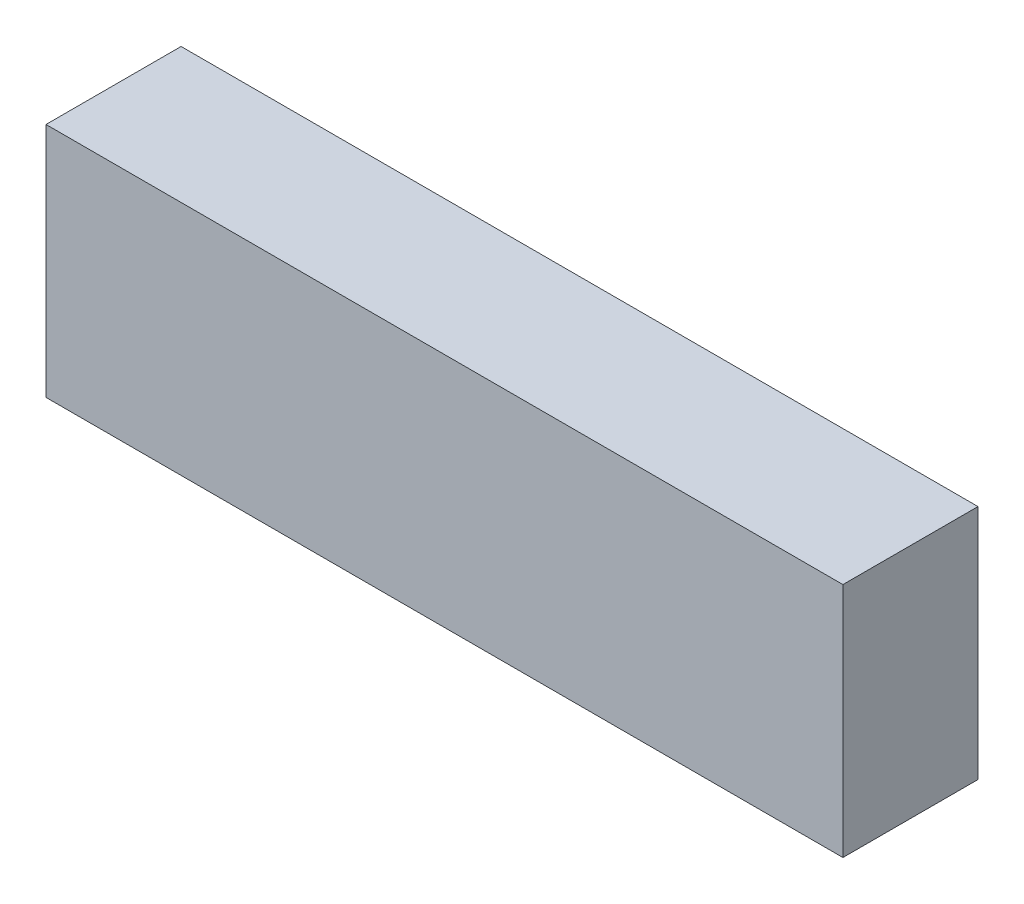
ISO-10303-21;
HEADER;
FILE_DESCRIPTION(('STEP AP214'),'2;1');
FILE_NAME('part.step','',(''),(''),'','','');
FILE_SCHEMA(('AUTOMOTIVE_DESIGN { 1 0 10303 214 1 1 1 1 }'));
ENDSEC;
DATA;
#1=APPLICATION_CONTEXT('core data for automotive mechanical design processes');
#2=APPLICATION_PROTOCOL_DEFINITION('international standard','automotive_design',2000,#1);
#3=PRODUCT_CONTEXT('',#1,'mechanical');
#4=PRODUCT('Part','Part','',(#3));
#5=PRODUCT_RELATED_PRODUCT_CATEGORY('part','',(#4));
#6=PRODUCT_DEFINITION_FORMATION('','',#4);
#7=PRODUCT_DEFINITION_CONTEXT('part definition',#1,'design');
#8=PRODUCT_DEFINITION('design','',#6,#7);
#9=PRODUCT_DEFINITION_SHAPE('','',#8);
#10=(LENGTH_UNIT() NAMED_UNIT(*) SI_UNIT(.MILLI.,.METRE.));
#11=(NAMED_UNIT(*) PLANE_ANGLE_UNIT() SI_UNIT($,.RADIAN.));
#12=(NAMED_UNIT(*) SI_UNIT($,.STERADIAN.) SOLID_ANGLE_UNIT());
#13=UNCERTAINTY_MEASURE_WITH_UNIT(LENGTH_MEASURE(1.E-05),#10,'distance_accuracy_value','');
#14=(GEOMETRIC_REPRESENTATION_CONTEXT(3) GLOBAL_UNCERTAINTY_ASSIGNED_CONTEXT((#13)) GLOBAL_UNIT_ASSIGNED_CONTEXT((#10,
#11,#12)) REPRESENTATION_CONTEXT('',''));
#15=CARTESIAN_POINT('',(0.,0.,0.));
#16=DIRECTION('',(0.,0.,1.));
#17=DIRECTION('',(1.,0.,0.));
#18=AXIS2_PLACEMENT_3D('',#15,#16,#17);
#19=CARTESIAN_POINT('',(116.40389819183,7.,8.70318281308284));
#20=DIRECTION('',(1.,0.,0.));
#21=DIRECTION('',(0.,0.,-1.));
#22=AXIS2_PLACEMENT_3D('',#19,#20,#21);
#23=PLANE('',#22);
#24=DIRECTION('',(0.,0.,1.));
#25=VECTOR('',#24,1.);
#26=CARTESIAN_POINT('',(116.40389819183,0.,8.70318281308284));
#27=LINE('',#26,#25);
#28=CARTESIAN_POINT('',(116.40389819183,0.,8.70318281308284));
#29=VERTEX_POINT('',#28);
#30=CARTESIAN_POINT('',(116.40389819183,0.,12.7031828130828));
#31=VERTEX_POINT('',#30);
#32=EDGE_CURVE('E11',#29,#31,#27,.T.);
#33=ORIENTED_EDGE('',*,*,#32,.T.);
#34=DIRECTION('',(0.,-1.,0.));
#35=VECTOR('',#34,1.);
#36=CARTESIAN_POINT('',(116.40389819183,7.,12.7031828130828));
#37=LINE('',#36,#35);
#38=CARTESIAN_POINT('',(116.40389819183,7.,12.7031828130828));
#39=VERTEX_POINT('',#38);
#40=EDGE_CURVE('E113',#39,#31,#37,.T.);
#41=ORIENTED_EDGE('',*,*,#40,.F.);
#42=DIRECTION('',(0.,0.,1.));
#43=VECTOR('',#42,1.);
#44=CARTESIAN_POINT('',(116.40389819183,7.,8.70318281308284));
#45=LINE('',#44,#43);
#46=CARTESIAN_POINT('',(116.40389819183,7.,8.70318281308284));
#47=VERTEX_POINT('',#46);
#48=EDGE_CURVE('E46',#47,#39,#45,.T.);
#49=ORIENTED_EDGE('',*,*,#48,.F.);
#50=DIRECTION('',(0.,-1.,0.));
#51=VECTOR('',#50,1.);
#52=CARTESIAN_POINT('',(116.40389819183,7.,8.70318281308284));
#53=LINE('',#52,#51);
#54=EDGE_CURVE('E101',#47,#29,#53,.T.);
#55=ORIENTED_EDGE('',*,*,#54,.T.);
#56=EDGE_LOOP('',(#33,#41,#49,#55));
#57=FACE_BOUND('',#56,.T.);
#58=ADVANCED_FACE('F42',(#57),#23,.F.);
#59=CARTESIAN_POINT('',(116.40389819183,7.,12.7031828130828));
#60=DIRECTION('',(0.,0.,-1.));
#61=DIRECTION('',(-1.,0.,0.));
#62=AXIS2_PLACEMENT_3D('',#59,#60,#61);
#63=PLANE('',#62);
#64=DIRECTION('',(1.,0.,0.));
#65=VECTOR('',#64,1.);
#66=CARTESIAN_POINT('',(116.40389819183,0.,12.7031828130828));
#67=LINE('',#66,#65);
#68=CARTESIAN_POINT('',(140.,0.,12.7031828130828));
#69=VERTEX_POINT('',#68);
#70=EDGE_CURVE('E52',#31,#69,#67,.T.);
#71=ORIENTED_EDGE('',*,*,#70,.T.);
#72=DIRECTION('',(0.,-1.,0.));
#73=VECTOR('',#72,1.);
#74=CARTESIAN_POINT('',(140.,7.,12.7031828130828));
#75=LINE('',#74,#73);
#76=CARTESIAN_POINT('',(140.,7.,12.7031828130828));
#77=VERTEX_POINT('',#76);
#78=EDGE_CURVE('E97',#77,#69,#75,.T.);
#79=ORIENTED_EDGE('',*,*,#78,.F.);
#80=DIRECTION('',(1.,0.,0.));
#81=VECTOR('',#80,1.);
#82=CARTESIAN_POINT('',(116.40389819183,7.,12.7031828130828));
#83=LINE('',#82,#81);
#84=EDGE_CURVE('E76',#39,#77,#83,.T.);
#85=ORIENTED_EDGE('',*,*,#84,.F.);
#86=ORIENTED_EDGE('',*,*,#40,.T.);
#87=EDGE_LOOP('',(#71,#79,#85,#86));
#88=FACE_BOUND('',#87,.T.);
#89=ADVANCED_FACE('F116',(#88),#63,.F.);
#90=CARTESIAN_POINT('',(140.,7.,12.7031828130828));
#91=DIRECTION('',(-1.,0.,0.));
#92=DIRECTION('',(0.,0.,1.));
#93=AXIS2_PLACEMENT_3D('',#90,#91,#92);
#94=PLANE('',#93);
#95=DIRECTION('',(0.,0.,-1.));
#96=VECTOR('',#95,1.);
#97=CARTESIAN_POINT('',(140.,0.,12.7031828130828));
#98=LINE('',#97,#96);
#99=CARTESIAN_POINT('',(140.,0.,8.70318281308283));
#100=VERTEX_POINT('',#99);
#101=EDGE_CURVE('E92',#69,#100,#98,.T.);
#102=ORIENTED_EDGE('',*,*,#101,.T.);
#103=DIRECTION('',(0.,-1.,0.));
#104=VECTOR('',#103,1.);
#105=CARTESIAN_POINT('',(140.,7.,8.70318281308283));
#106=LINE('',#105,#104);
#107=CARTESIAN_POINT('',(140.,7.,8.70318281308283));
#108=VERTEX_POINT('',#107);
#109=EDGE_CURVE('E95',#108,#100,#106,.T.);
#110=ORIENTED_EDGE('',*,*,#109,.F.);
#111=DIRECTION('',(0.,0.,-1.));
#112=VECTOR('',#111,1.);
#113=CARTESIAN_POINT('',(140.,7.,12.7031828130828));
#114=LINE('',#113,#112);
#115=EDGE_CURVE('E109',#77,#108,#114,.T.);
#116=ORIENTED_EDGE('',*,*,#115,.F.);
#117=ORIENTED_EDGE('',*,*,#78,.T.);
#118=EDGE_LOOP('',(#102,#110,#116,#117));
#119=FACE_BOUND('',#118,.T.);
#120=ADVANCED_FACE('F93',(#119),#94,.F.);
#121=CARTESIAN_POINT('',(140.,7.,8.70318281308283));
#122=DIRECTION('',(0.,0.,1.));
#123=DIRECTION('',(1.,0.,0.));
#124=AXIS2_PLACEMENT_3D('',#121,#122,#123);
#125=PLANE('',#124);
#126=DIRECTION('',(-1.,0.,0.));
#127=VECTOR('',#126,1.);
#128=CARTESIAN_POINT('',(140.,0.,8.70318281308283));
#129=LINE('',#128,#127);
#130=EDGE_CURVE('E86',#100,#29,#129,.T.);
#131=ORIENTED_EDGE('',*,*,#130,.T.);
#132=ORIENTED_EDGE('',*,*,#54,.F.);
#133=DIRECTION('',(-1.,0.,0.));
#134=VECTOR('',#133,1.);
#135=CARTESIAN_POINT('',(140.,7.,8.70318281308283));
#136=LINE('',#135,#134);
#137=EDGE_CURVE('E100',#108,#47,#136,.T.);
#138=ORIENTED_EDGE('',*,*,#137,.F.);
#139=ORIENTED_EDGE('',*,*,#109,.T.);
#140=EDGE_LOOP('',(#131,#132,#138,#139));
#141=FACE_BOUND('',#140,.T.);
#142=ADVANCED_FACE('F99',(#141),#125,.F.);
#143=CARTESIAN_POINT('',(0.,7.,0.));
#144=DIRECTION('',(0.,1.,0.));
#145=DIRECTION('',(0.,0.,1.));
#146=AXIS2_PLACEMENT_3D('',#143,#144,#145);
#147=PLANE('',#146);
#148=ORIENTED_EDGE('',*,*,#48,.T.);
#149=ORIENTED_EDGE('',*,*,#84,.T.);
#150=ORIENTED_EDGE('',*,*,#115,.T.);
#151=ORIENTED_EDGE('',*,*,#137,.T.);
#152=EDGE_LOOP('',(#148,#149,#150,#151));
#153=FACE_BOUND('',#152,.T.);
#154=ADVANCED_FACE('F44',(#153),#147,.T.);
#155=CARTESIAN_POINT('',(0.,0.,0.));
#156=DIRECTION('',(0.,1.,0.));
#157=DIRECTION('',(0.,0.,1.));
#158=AXIS2_PLACEMENT_3D('',#155,#156,#157);
#159=PLANE('',#158);
#160=ORIENTED_EDGE('',*,*,#32,.F.);
#161=ORIENTED_EDGE('',*,*,#130,.F.);
#162=ORIENTED_EDGE('',*,*,#101,.F.);
#163=ORIENTED_EDGE('',*,*,#70,.F.);
#164=EDGE_LOOP('',(#160,#161,#162,#163));
#165=FACE_BOUND('',#164,.T.);
#166=ADVANCED_FACE('F103',(#165),#159,.F.);
#167=CLOSED_SHELL('',(#58,#89,#120,#142,#154,#166));
#168=MANIFOLD_SOLID_BREP('B2',#167);
#169=ADVANCED_BREP_SHAPE_REPRESENTATION('',(#18,#168),#14);
#170=SHAPE_DEFINITION_REPRESENTATION(#9,#169);
ENDSEC;
END-ISO-10303-21;
